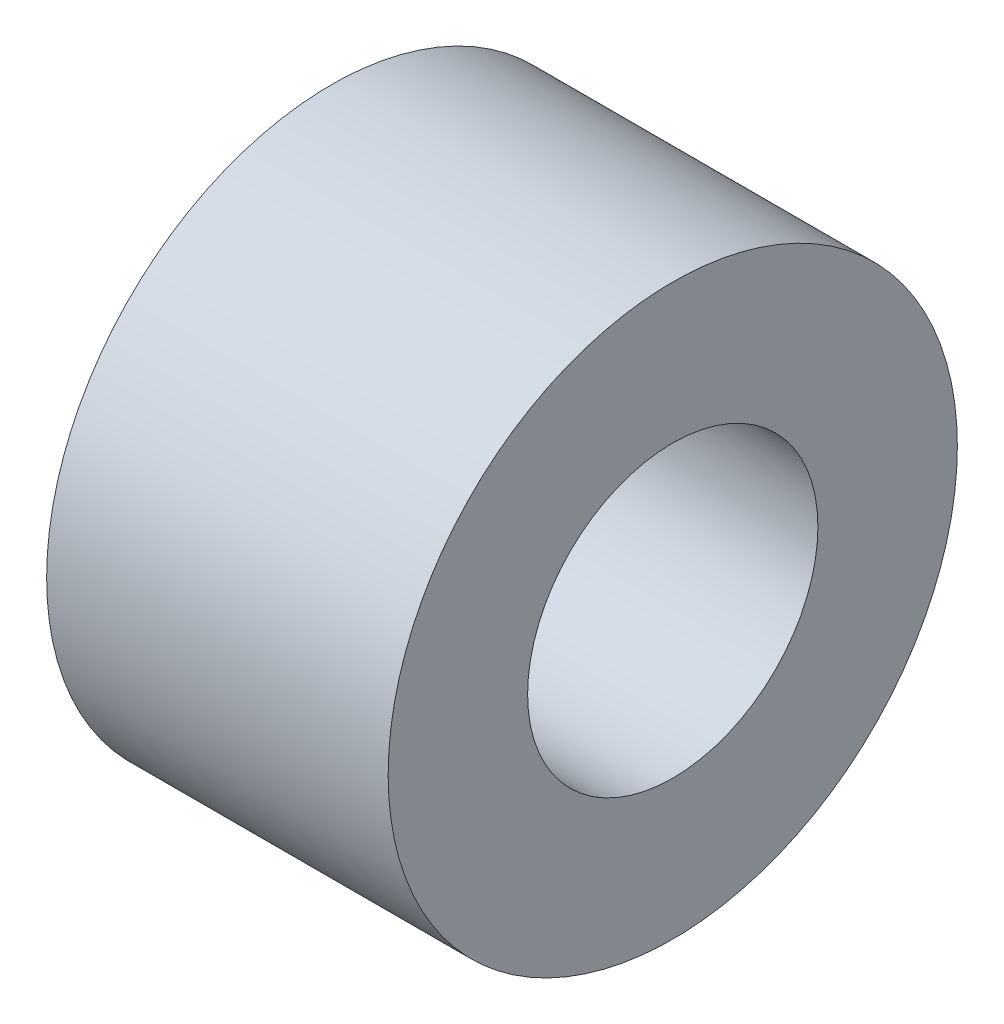
ISO-10303-21;
HEADER;
FILE_DESCRIPTION(('STEP AP214'),'2;1');
FILE_NAME('part.step','',(''),(''),'','','');
FILE_SCHEMA(('AUTOMOTIVE_DESIGN { 1 0 10303 214 1 1 1 1 }'));
ENDSEC;
DATA;
#1=APPLICATION_CONTEXT('core data for automotive mechanical design processes');
#2=APPLICATION_PROTOCOL_DEFINITION('international standard','automotive_design',2000,#1);
#3=PRODUCT_CONTEXT('',#1,'mechanical');
#4=PRODUCT('Part','Part','',(#3));
#5=PRODUCT_RELATED_PRODUCT_CATEGORY('part','',(#4));
#6=PRODUCT_DEFINITION_FORMATION('','',#4);
#7=PRODUCT_DEFINITION_CONTEXT('part definition',#1,'design');
#8=PRODUCT_DEFINITION('design','',#6,#7);
#9=PRODUCT_DEFINITION_SHAPE('','',#8);
#10=(LENGTH_UNIT() NAMED_UNIT(*) SI_UNIT(.MILLI.,.METRE.));
#11=(NAMED_UNIT(*) PLANE_ANGLE_UNIT() SI_UNIT($,.RADIAN.));
#12=(NAMED_UNIT(*) SI_UNIT($,.STERADIAN.) SOLID_ANGLE_UNIT());
#13=UNCERTAINTY_MEASURE_WITH_UNIT(LENGTH_MEASURE(1.E-05),#10,'distance_accuracy_value','');
#14=(GEOMETRIC_REPRESENTATION_CONTEXT(3) GLOBAL_UNCERTAINTY_ASSIGNED_CONTEXT((#13)) GLOBAL_UNIT_ASSIGNED_CONTEXT((#10,
#11,#12)) REPRESENTATION_CONTEXT('',''));
#15=CARTESIAN_POINT('',(0.,0.,0.));
#16=DIRECTION('',(0.,0.,1.));
#17=DIRECTION('',(1.,0.,0.));
#18=AXIS2_PLACEMENT_3D('',#15,#16,#17);
#19=CARTESIAN_POINT('',(7.62,0.,0.));
#20=DIRECTION('',(1.,0.,0.));
#21=DIRECTION('',(0.,0.,-1.));
#22=AXIS2_PLACEMENT_3D('',#19,#20,#21);
#23=PLANE('',#22);
#24=CARTESIAN_POINT('',(7.62,0.,0.));
#25=DIRECTION('',(1.,0.,0.));
#26=DIRECTION('',(0.,0.,-1.));
#27=AXIS2_PLACEMENT_3D('',#24,#25,#26);
#28=CIRCLE('',#27,6.35);
#29=CARTESIAN_POINT('',(7.62,0.,6.35));
#30=VERTEX_POINT('',#29);
#31=EDGE_CURVE('E10',#30,#30,#28,.T.);
#32=ORIENTED_EDGE('',*,*,#31,.T.);
#33=EDGE_LOOP('',(#32));
#34=FACE_BOUND('',#33,.T.);
#35=CARTESIAN_POINT('',(7.62,0.,0.));
#36=DIRECTION('',(1.,0.,0.));
#37=DIRECTION('',(0.,0.,-1.));
#38=AXIS2_PLACEMENT_3D('',#35,#36,#37);
#39=CIRCLE('',#38,3.2385);
#40=CARTESIAN_POINT('',(7.62,0.,3.2385));
#41=VERTEX_POINT('',#40);
#42=EDGE_CURVE('E42',#41,#41,#39,.T.);
#43=ORIENTED_EDGE('',*,*,#42,.F.);
#44=EDGE_LOOP('',(#43));
#45=FACE_BOUND('',#44,.T.);
#46=ADVANCED_FACE('F31',(#34,#45),#23,.T.);
#47=CARTESIAN_POINT('',(0.,0.,0.));
#48=DIRECTION('',(1.,0.,0.));
#49=DIRECTION('',(0.,0.,-1.));
#50=AXIS2_PLACEMENT_3D('',#47,#48,#49);
#51=PLANE('',#50);
#52=CARTESIAN_POINT('',(0.,0.,0.));
#53=DIRECTION('',(1.,0.,0.));
#54=DIRECTION('',(0.,0.,-1.));
#55=AXIS2_PLACEMENT_3D('',#52,#53,#54);
#56=CIRCLE('',#55,6.35);
#57=CARTESIAN_POINT('',(0.,0.,6.35));
#58=VERTEX_POINT('',#57);
#59=EDGE_CURVE('E35',#58,#58,#56,.T.);
#60=ORIENTED_EDGE('',*,*,#59,.F.);
#61=EDGE_LOOP('',(#60));
#62=FACE_BOUND('',#61,.T.);
#63=CARTESIAN_POINT('',(0.,0.,0.));
#64=DIRECTION('',(1.,0.,0.));
#65=DIRECTION('',(0.,0.,-1.));
#66=AXIS2_PLACEMENT_3D('',#63,#64,#65);
#67=CIRCLE('',#66,3.2385);
#68=CARTESIAN_POINT('',(0.,0.,3.2385));
#69=VERTEX_POINT('',#68);
#70=EDGE_CURVE('E44',#69,#69,#67,.T.);
#71=ORIENTED_EDGE('',*,*,#70,.T.);
#72=EDGE_LOOP('',(#71));
#73=FACE_BOUND('',#72,.T.);
#74=ADVANCED_FACE('F54',(#62,#73),#51,.F.);
#75=CARTESIAN_POINT('',(7.62,0.,0.));
#76=DIRECTION('',(-1.,0.,0.));
#77=DIRECTION('',(0.,0.,1.));
#78=AXIS2_PLACEMENT_3D('',#75,#76,#77);
#79=CYLINDRICAL_SURFACE('',#78,6.35);
#80=CARTESIAN_POINT('',(7.62,0.,6.35));
#81=CARTESIAN_POINT('',(7.540625,0.,6.35));
#82=CARTESIAN_POINT('',(7.46125,0.,6.35));
#83=CARTESIAN_POINT('',(7.3025,0.,6.35));
#84=CARTESIAN_POINT('',(7.223125,0.,6.35));
#85=CARTESIAN_POINT('',(7.064375,0.,6.35));
#86=CARTESIAN_POINT('',(6.985,0.,6.35));
#87=CARTESIAN_POINT('',(6.82625,0.,6.35));
#88=CARTESIAN_POINT('',(6.746875,0.,6.35));
#89=CARTESIAN_POINT('',(6.588125,0.,6.35));
#90=CARTESIAN_POINT('',(6.50875,0.,6.35));
#91=CARTESIAN_POINT('',(6.35,0.,6.35));
#92=CARTESIAN_POINT('',(6.270625,0.,6.35));
#93=CARTESIAN_POINT('',(6.111875,0.,6.35));
#94=CARTESIAN_POINT('',(6.0325,0.,6.35));
#95=CARTESIAN_POINT('',(5.87375,0.,6.35));
#96=CARTESIAN_POINT('',(5.794375,0.,6.35));
#97=CARTESIAN_POINT('',(5.635625,0.,6.35));
#98=CARTESIAN_POINT('',(5.55625,0.,6.35));
#99=CARTESIAN_POINT('',(5.3975,0.,6.35));
#100=CARTESIAN_POINT('',(5.318125,0.,6.35));
#101=CARTESIAN_POINT('',(5.159375,0.,6.35));
#102=CARTESIAN_POINT('',(5.08,0.,6.35));
#103=CARTESIAN_POINT('',(4.92125,0.,6.35));
#104=CARTESIAN_POINT('',(4.841875,0.,6.35));
#105=CARTESIAN_POINT('',(4.683125,0.,6.35));
#106=CARTESIAN_POINT('',(4.60375,0.,6.35));
#107=CARTESIAN_POINT('',(4.445,0.,6.35));
#108=CARTESIAN_POINT('',(4.365625,0.,6.35));
#109=CARTESIAN_POINT('',(4.206875,0.,6.35));
#110=CARTESIAN_POINT('',(4.1275,0.,6.35));
#111=CARTESIAN_POINT('',(3.96875,0.,6.35));
#112=CARTESIAN_POINT('',(3.889375,0.,6.35));
#113=CARTESIAN_POINT('',(3.730625,0.,6.35));
#114=CARTESIAN_POINT('',(3.65125,0.,6.35));
#115=CARTESIAN_POINT('',(3.4925,0.,6.35));
#116=CARTESIAN_POINT('',(3.413125,0.,6.35));
#117=CARTESIAN_POINT('',(3.254375,0.,6.35));
#118=CARTESIAN_POINT('',(3.175,0.,6.35));
#119=CARTESIAN_POINT('',(3.01625,0.,6.35));
#120=CARTESIAN_POINT('',(2.936875,0.,6.35));
#121=CARTESIAN_POINT('',(2.778125,0.,6.35));
#122=CARTESIAN_POINT('',(2.69875,0.,6.35));
#123=CARTESIAN_POINT('',(2.54,0.,6.35));
#124=CARTESIAN_POINT('',(2.460625,0.,6.35));
#125=CARTESIAN_POINT('',(2.301875,0.,6.35));
#126=CARTESIAN_POINT('',(2.2225,0.,6.35));
#127=CARTESIAN_POINT('',(2.06375,0.,6.35));
#128=CARTESIAN_POINT('',(1.984375,0.,6.35));
#129=CARTESIAN_POINT('',(1.825625,0.,6.35));
#130=CARTESIAN_POINT('',(1.74625,0.,6.35));
#131=CARTESIAN_POINT('',(1.5875,0.,6.35));
#132=CARTESIAN_POINT('',(1.508125,0.,6.35));
#133=CARTESIAN_POINT('',(1.349375,0.,6.35));
#134=CARTESIAN_POINT('',(1.27,0.,6.35));
#135=CARTESIAN_POINT('',(1.11125,0.,6.35));
#136=CARTESIAN_POINT('',(1.031875,0.,6.35));
#137=CARTESIAN_POINT('',(0.873125,0.,6.35));
#138=CARTESIAN_POINT('',(0.79375,0.,6.35));
#139=CARTESIAN_POINT('',(0.635,0.,6.35));
#140=CARTESIAN_POINT('',(0.555625,0.,6.35));
#141=CARTESIAN_POINT('',(0.396875,0.,6.35));
#142=CARTESIAN_POINT('',(0.3175,0.,6.35));
#143=CARTESIAN_POINT('',(0.15875,0.,6.35));
#144=CARTESIAN_POINT('',(0.0793749999999999,0.,6.35));
#145=CARTESIAN_POINT('',(0.,0.,6.35));
#146=B_SPLINE_CURVE_WITH_KNOTS('',3,(#80,#81,#82,#83,#84,#85,#86,#87,#88,#89,#90,#91,#92,#93,
#94,#95,#96,#97,#98,#99,#100,#101,#102,#103,#104,#105,#106,#107,#108,#109,#110,#111,#112,#113,
#114,#115,#116,#117,#118,#119,#120,#121,#122,#123,#124,#125,#126,#127,#128,#129,#130,#131,#132,
#133,#134,#135,#136,#137,#138,#139,#140,#141,#142,#143,#144,#145),.UNSPECIFIED.,.F.,.F.,(4,2,2,
2,2,2,2,2,2,2,2,2,2,2,2,2,2,2,2,2,2,2,2,2,2,2,2,2,2,2,2,2,4),(0.,0.238125,0.476249999999999,
0.714375,0.952499999999999,1.190625,1.42875,1.666875,1.905,2.143125,2.38125,2.619375,2.8575,
3.095625,3.33375,3.571875,3.81,4.048125,4.28625,4.524375,4.7625,5.000625,5.23875,5.476875,5.715,
5.953125,6.19125,6.429375,6.6675,6.905625,7.14375,7.381875,7.62),.UNSPECIFIED.);
#147=EDGE_CURVE('BSEAM33',#30,#58,#146,.T.);
#148=ORIENTED_EDGE('',*,*,#31,.F.);
#149=ORIENTED_EDGE('',*,*,#59,.T.);
#150=ORIENTED_EDGE('',*,*,#147,.T.);
#151=ORIENTED_EDGE('',*,*,#147,.F.);
#152=EDGE_LOOP('',(#148,#150,#149,#151));
#153=FACE_BOUND('',#152,.T.);
#154=ADVANCED_FACE('F33',(#153),#79,.T.);
#155=CARTESIAN_POINT('',(7.62,0.,0.));
#156=DIRECTION('',(-1.,0.,0.));
#157=DIRECTION('',(0.,0.,1.));
#158=AXIS2_PLACEMENT_3D('',#155,#156,#157);
#159=CYLINDRICAL_SURFACE('',#158,3.2385);
#160=CARTESIAN_POINT('',(7.62,0.,3.2385));
#161=CARTESIAN_POINT('',(7.540625,0.,3.2385));
#162=CARTESIAN_POINT('',(7.46125,0.,3.2385));
#163=CARTESIAN_POINT('',(7.3025,0.,3.2385));
#164=CARTESIAN_POINT('',(7.223125,0.,3.2385));
#165=CARTESIAN_POINT('',(7.064375,0.,3.2385));
#166=CARTESIAN_POINT('',(6.985,0.,3.2385));
#167=CARTESIAN_POINT('',(6.82625,0.,3.2385));
#168=CARTESIAN_POINT('',(6.746875,0.,3.2385));
#169=CARTESIAN_POINT('',(6.588125,0.,3.2385));
#170=CARTESIAN_POINT('',(6.50875,0.,3.2385));
#171=CARTESIAN_POINT('',(6.35,0.,3.2385));
#172=CARTESIAN_POINT('',(6.270625,0.,3.2385));
#173=CARTESIAN_POINT('',(6.111875,0.,3.2385));
#174=CARTESIAN_POINT('',(6.0325,0.,3.2385));
#175=CARTESIAN_POINT('',(5.87375,0.,3.2385));
#176=CARTESIAN_POINT('',(5.794375,0.,3.2385));
#177=CARTESIAN_POINT('',(5.635625,0.,3.2385));
#178=CARTESIAN_POINT('',(5.55625,0.,3.2385));
#179=CARTESIAN_POINT('',(5.3975,0.,3.2385));
#180=CARTESIAN_POINT('',(5.318125,0.,3.2385));
#181=CARTESIAN_POINT('',(5.159375,0.,3.2385));
#182=CARTESIAN_POINT('',(5.08,0.,3.2385));
#183=CARTESIAN_POINT('',(4.92125,0.,3.2385));
#184=CARTESIAN_POINT('',(4.841875,0.,3.2385));
#185=CARTESIAN_POINT('',(4.683125,0.,3.2385));
#186=CARTESIAN_POINT('',(4.60375,0.,3.2385));
#187=CARTESIAN_POINT('',(4.445,0.,3.2385));
#188=CARTESIAN_POINT('',(4.365625,0.,3.2385));
#189=CARTESIAN_POINT('',(4.206875,0.,3.2385));
#190=CARTESIAN_POINT('',(4.1275,0.,3.2385));
#191=CARTESIAN_POINT('',(3.96875,0.,3.2385));
#192=CARTESIAN_POINT('',(3.889375,0.,3.2385));
#193=CARTESIAN_POINT('',(3.730625,0.,3.2385));
#194=CARTESIAN_POINT('',(3.65125,0.,3.2385));
#195=CARTESIAN_POINT('',(3.4925,0.,3.2385));
#196=CARTESIAN_POINT('',(3.413125,0.,3.2385));
#197=CARTESIAN_POINT('',(3.254375,0.,3.2385));
#198=CARTESIAN_POINT('',(3.175,0.,3.2385));
#199=CARTESIAN_POINT('',(3.01625,0.,3.2385));
#200=CARTESIAN_POINT('',(2.936875,0.,3.2385));
#201=CARTESIAN_POINT('',(2.778125,0.,3.2385));
#202=CARTESIAN_POINT('',(2.69875,0.,3.2385));
#203=CARTESIAN_POINT('',(2.54,0.,3.2385));
#204=CARTESIAN_POINT('',(2.460625,0.,3.2385));
#205=CARTESIAN_POINT('',(2.301875,0.,3.2385));
#206=CARTESIAN_POINT('',(2.2225,0.,3.2385));
#207=CARTESIAN_POINT('',(2.06375,0.,3.2385));
#208=CARTESIAN_POINT('',(1.984375,0.,3.2385));
#209=CARTESIAN_POINT('',(1.825625,0.,3.2385));
#210=CARTESIAN_POINT('',(1.74625,0.,3.2385));
#211=CARTESIAN_POINT('',(1.5875,0.,3.2385));
#212=CARTESIAN_POINT('',(1.508125,0.,3.2385));
#213=CARTESIAN_POINT('',(1.349375,0.,3.2385));
#214=CARTESIAN_POINT('',(1.27,0.,3.2385));
#215=CARTESIAN_POINT('',(1.11125,0.,3.2385));
#216=CARTESIAN_POINT('',(1.031875,0.,3.2385));
#217=CARTESIAN_POINT('',(0.873125,0.,3.2385));
#218=CARTESIAN_POINT('',(0.79375,0.,3.2385));
#219=CARTESIAN_POINT('',(0.635,0.,3.2385));
#220=CARTESIAN_POINT('',(0.555625,0.,3.2385));
#221=CARTESIAN_POINT('',(0.396875,0.,3.2385));
#222=CARTESIAN_POINT('',(0.3175,0.,3.2385));
#223=CARTESIAN_POINT('',(0.15875,0.,3.2385));
#224=CARTESIAN_POINT('',(0.0793749999999999,0.,3.2385));
#225=CARTESIAN_POINT('',(0.,0.,3.2385));
#226=B_SPLINE_CURVE_WITH_KNOTS('',3,(#160,#161,#162,#163,#164,#165,#166,#167,#168,#169,#170,
#171,#172,#173,#174,#175,#176,#177,#178,#179,#180,#181,#182,#183,#184,#185,#186,#187,#188,#189,
#190,#191,#192,#193,#194,#195,#196,#197,#198,#199,#200,#201,#202,#203,#204,#205,#206,#207,#208,
#209,#210,#211,#212,#213,#214,#215,#216,#217,#218,#219,#220,#221,#222,#223,#224,#225),
.UNSPECIFIED.,.F.,.F.,(4,2,2,2,2,2,2,2,2,2,2,2,2,2,2,2,2,2,2,2,2,2,2,2,2,2,2,2,2,2,2,2,4),(0.,
0.238125,0.476249999999999,0.714375,0.952499999999999,1.190625,1.42875,1.666875,1.905,2.143125,
2.38125,2.619375,2.8575,3.095625,3.33375,3.571875,3.81,4.048125,4.28625,4.524375,4.7625,
5.000625,5.23875,5.476875,5.715,5.953125,6.19125,6.429375,6.6675,6.905625,7.14375,7.381875,
7.62),.UNSPECIFIED.);
#227=EDGE_CURVE('BSEAM50',#41,#69,#226,.T.);
#228=ORIENTED_EDGE('',*,*,#42,.T.);
#229=ORIENTED_EDGE('',*,*,#70,.F.);
#230=ORIENTED_EDGE('',*,*,#227,.T.);
#231=ORIENTED_EDGE('',*,*,#227,.F.);
#232=EDGE_LOOP('',(#228,#230,#229,#231));
#233=FACE_BOUND('',#232,.T.);
#234=ADVANCED_FACE('F50',(#233),#159,.F.);
#235=CLOSED_SHELL('',(#46,#74,#154,#234));
#236=MANIFOLD_SOLID_BREP('B2',#235);
#237=ADVANCED_BREP_SHAPE_REPRESENTATION('',(#18,#236),#14);
#238=SHAPE_DEFINITION_REPRESENTATION(#9,#237);
ENDSEC;
END-ISO-10303-21;
